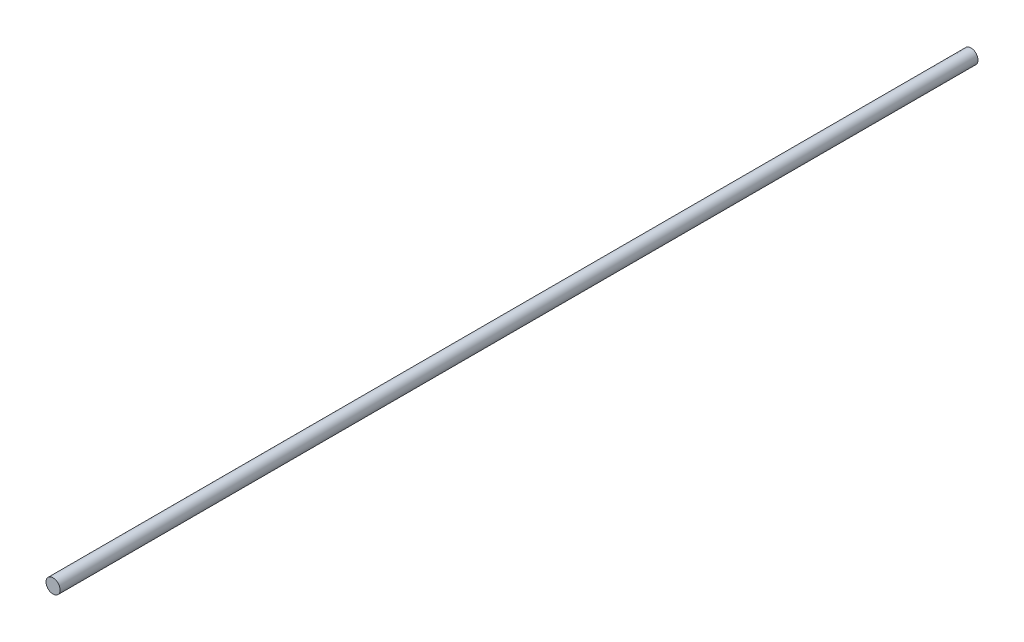
ISO-10303-21;
HEADER;
FILE_DESCRIPTION(('STEP AP214'),'2;1');
FILE_NAME('part.step','',(''),(''),'','','');
FILE_SCHEMA(('AUTOMOTIVE_DESIGN { 1 0 10303 214 1 1 1 1 }'));
ENDSEC;
DATA;
#1=APPLICATION_CONTEXT('core data for automotive mechanical design processes');
#2=APPLICATION_PROTOCOL_DEFINITION('international standard','automotive_design',2000,#1);
#3=PRODUCT_CONTEXT('',#1,'mechanical');
#4=PRODUCT('Part','Part','',(#3));
#5=PRODUCT_RELATED_PRODUCT_CATEGORY('part','',(#4));
#6=PRODUCT_DEFINITION_FORMATION('','',#4);
#7=PRODUCT_DEFINITION_CONTEXT('part definition',#1,'design');
#8=PRODUCT_DEFINITION('design','',#6,#7);
#9=PRODUCT_DEFINITION_SHAPE('','',#8);
#10=(LENGTH_UNIT() NAMED_UNIT(*) SI_UNIT(.MILLI.,.METRE.));
#11=(NAMED_UNIT(*) PLANE_ANGLE_UNIT() SI_UNIT($,.RADIAN.));
#12=(NAMED_UNIT(*) SI_UNIT($,.STERADIAN.) SOLID_ANGLE_UNIT());
#13=UNCERTAINTY_MEASURE_WITH_UNIT(LENGTH_MEASURE(1.E-05),#10,'distance_accuracy_value','');
#14=(GEOMETRIC_REPRESENTATION_CONTEXT(3) GLOBAL_UNCERTAINTY_ASSIGNED_CONTEXT((#13)) GLOBAL_UNIT_ASSIGNED_CONTEXT((#10,
#11,#12)) REPRESENTATION_CONTEXT('',''));
#15=CARTESIAN_POINT('',(0.,0.,0.));
#16=DIRECTION('',(0.,0.,1.));
#17=DIRECTION('',(1.,0.,0.));
#18=AXIS2_PLACEMENT_3D('',#15,#16,#17);
#19=CARTESIAN_POINT('',(0.,0.,520.));
#20=DIRECTION('',(0.,0.,-1.));
#21=DIRECTION('',(-1.,0.,0.));
#22=AXIS2_PLACEMENT_3D('',#19,#20,#21);
#23=CYLINDRICAL_SURFACE('',#22,4.);
#24=CARTESIAN_POINT('',(0.,0.,520.));
#25=DIRECTION('',(0.,0.,1.));
#26=DIRECTION('',(1.,0.,0.));
#27=AXIS2_PLACEMENT_3D('',#24,#25,#26);
#28=CIRCLE('',#27,4.);
#29=CARTESIAN_POINT('',(4.,0.,520.));
#30=VERTEX_POINT('',#29);
#31=EDGE_CURVE('E10',#30,#30,#28,.T.);
#32=ORIENTED_EDGE('',*,*,#31,.F.);
#33=EDGE_LOOP('',(#32));
#34=FACE_BOUND('',#33,.T.);
#35=CARTESIAN_POINT('',(0.,0.,0.));
#36=DIRECTION('',(0.,0.,1.));
#37=DIRECTION('',(1.,0.,0.));
#38=AXIS2_PLACEMENT_3D('',#35,#36,#37);
#39=CIRCLE('',#38,4.);
#40=CARTESIAN_POINT('',(4.,0.,0.));
#41=VERTEX_POINT('',#40);
#42=EDGE_CURVE('E36',#41,#41,#39,.T.);
#43=ORIENTED_EDGE('',*,*,#42,.T.);
#44=EDGE_LOOP('',(#43));
#45=FACE_BOUND('',#44,.T.);
#46=ADVANCED_FACE('F33',(#34,#45),#23,.T.);
#47=CARTESIAN_POINT('',(0.,0.,520.));
#48=DIRECTION('',(0.,0.,1.));
#49=DIRECTION('',(1.,0.,0.));
#50=AXIS2_PLACEMENT_3D('',#47,#48,#49);
#51=PLANE('',#50);
#52=ORIENTED_EDGE('',*,*,#31,.T.);
#53=EDGE_LOOP('',(#52));
#54=FACE_BOUND('',#53,.T.);
#55=ADVANCED_FACE('F48',(#54),#51,.T.);
#56=CARTESIAN_POINT('',(0.,0.,0.));
#57=DIRECTION('',(0.,0.,1.));
#58=DIRECTION('',(1.,0.,0.));
#59=AXIS2_PLACEMENT_3D('',#56,#57,#58);
#60=PLANE('',#59);
#61=ORIENTED_EDGE('',*,*,#42,.F.);
#62=EDGE_LOOP('',(#61));
#63=FACE_BOUND('',#62,.T.);
#64=ADVANCED_FACE('F46',(#63),#60,.F.);
#65=CLOSED_SHELL('',(#46,#55,#64));
#66=MANIFOLD_SOLID_BREP('B2',#65);
#67=ADVANCED_BREP_SHAPE_REPRESENTATION('',(#18,#66),#14);
#68=SHAPE_DEFINITION_REPRESENTATION(#9,#67);
ENDSEC;
END-ISO-10303-21;
